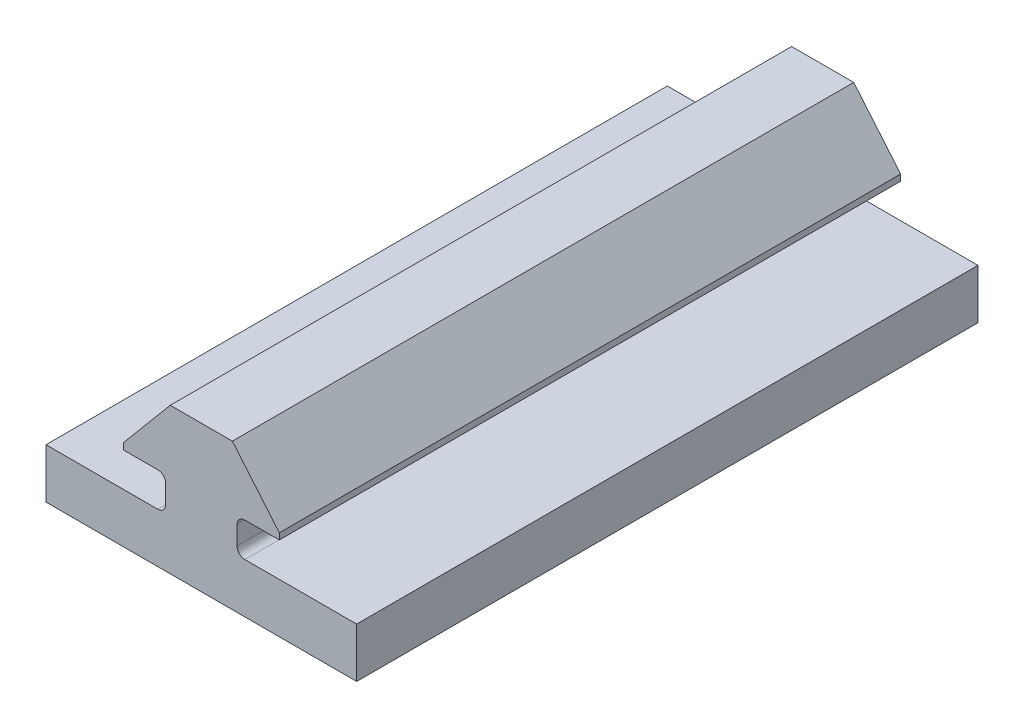
ISO-10303-21;
HEADER;
FILE_DESCRIPTION(('STEP AP214'),'2;1');
FILE_NAME('part.step','',(''),(''),'','','');
FILE_SCHEMA(('AUTOMOTIVE_DESIGN { 1 0 10303 214 1 1 1 1 }'));
ENDSEC;
DATA;
#1=APPLICATION_CONTEXT('core data for automotive mechanical design processes');
#2=APPLICATION_PROTOCOL_DEFINITION('international standard','automotive_design',2000,#1);
#3=PRODUCT_CONTEXT('',#1,'mechanical');
#4=PRODUCT('Part','Part','',(#3));
#5=PRODUCT_RELATED_PRODUCT_CATEGORY('part','',(#4));
#6=PRODUCT_DEFINITION_FORMATION('','',#4);
#7=PRODUCT_DEFINITION_CONTEXT('part definition',#1,'design');
#8=PRODUCT_DEFINITION('design','',#6,#7);
#9=PRODUCT_DEFINITION_SHAPE('','',#8);
#10=(LENGTH_UNIT() NAMED_UNIT(*) SI_UNIT(.MILLI.,.METRE.));
#11=(NAMED_UNIT(*) PLANE_ANGLE_UNIT() SI_UNIT($,.RADIAN.));
#12=(NAMED_UNIT(*) SI_UNIT($,.STERADIAN.) SOLID_ANGLE_UNIT());
#13=UNCERTAINTY_MEASURE_WITH_UNIT(LENGTH_MEASURE(1.E-05),#10,'distance_accuracy_value','');
#14=(GEOMETRIC_REPRESENTATION_CONTEXT(3) GLOBAL_UNCERTAINTY_ASSIGNED_CONTEXT((#13)) GLOBAL_UNIT_ASSIGNED_CONTEXT((#10,
#11,#12)) REPRESENTATION_CONTEXT('',''));
#15=CARTESIAN_POINT('',(0.,0.,0.));
#16=DIRECTION('',(0.,0.,1.));
#17=DIRECTION('',(1.,0.,0.));
#18=AXIS2_PLACEMENT_3D('',#15,#16,#17);
#19=CARTESIAN_POINT('',(-12.7,0.,-3733.8));
#20=DIRECTION('',(1.,0.,0.));
#21=DIRECTION('',(0.,0.,-1.));
#22=AXIS2_PLACEMENT_3D('',#19,#20,#21);
#23=PLANE('',#22);
#24=DIRECTION('',(0.,1.,0.));
#25=VECTOR('',#24,1.);
#26=CARTESIAN_POINT('',(-12.7,0.,-3683.));
#27=LINE('',#26,#25);
#28=CARTESIAN_POINT('',(-12.7,0.,-3683.));
#29=VERTEX_POINT('',#28);
#30=CARTESIAN_POINT('',(-12.7,4.064,-3683.));
#31=VERTEX_POINT('',#30);
#32=EDGE_CURVE('E189',#29,#31,#27,.T.);
#33=ORIENTED_EDGE('',*,*,#32,.T.);
#34=DIRECTION('',(0.,0.,1.));
#35=VECTOR('',#34,1.);
#36=CARTESIAN_POINT('',(-12.7,4.064,-3733.8));
#37=LINE('',#36,#35);
#38=CARTESIAN_POINT('',(-12.7,4.064,-3733.8));
#39=VERTEX_POINT('',#38);
#40=EDGE_CURVE('E11',#39,#31,#37,.T.);
#41=ORIENTED_EDGE('',*,*,#40,.F.);
#42=DIRECTION('',(0.,1.,0.));
#43=VECTOR('',#42,1.);
#44=CARTESIAN_POINT('',(-12.7,0.,-3733.8));
#45=LINE('',#44,#43);
#46=CARTESIAN_POINT('',(-12.7,0.,-3733.8));
#47=VERTEX_POINT('',#46);
#48=EDGE_CURVE('E223',#47,#39,#45,.T.);
#49=ORIENTED_EDGE('',*,*,#48,.F.);
#50=DIRECTION('',(0.,0.,1.));
#51=VECTOR('',#50,1.);
#52=CARTESIAN_POINT('',(-12.7,0.,-3733.8));
#53=LINE('',#52,#51);
#54=EDGE_CURVE('E185',#47,#29,#53,.T.);
#55=ORIENTED_EDGE('',*,*,#54,.T.);
#56=EDGE_LOOP('',(#33,#41,#49,#55));
#57=FACE_BOUND('',#56,.T.);
#58=ADVANCED_FACE('F33',(#57),#23,.F.);
#59=CARTESIAN_POINT('',(-12.7,4.064,-3733.8));
#60=DIRECTION('',(0.,-1.,0.));
#61=DIRECTION('',(0.,0.,-1.));
#62=AXIS2_PLACEMENT_3D('',#59,#60,#61);
#63=PLANE('',#62);
#64=DIRECTION('',(1.,0.,0.));
#65=VECTOR('',#64,1.);
#66=CARTESIAN_POINT('',(-12.7,4.064,-3683.));
#67=LINE('',#66,#65);
#68=CARTESIAN_POINT('',(-3.55599999999985,4.064,-3683.));
#69=VERTEX_POINT('',#68);
#70=EDGE_CURVE('E192',#31,#69,#67,.T.);
#71=ORIENTED_EDGE('',*,*,#70,.T.);
#72=DIRECTION('',(0.,0.,1.));
#73=VECTOR('',#72,1.);
#74=CARTESIAN_POINT('',(-3.55599999999985,4.064,-3733.8));
#75=LINE('',#74,#73);
#76=CARTESIAN_POINT('',(-3.55599999999985,4.064,-3733.8));
#77=VERTEX_POINT('',#76);
#78=EDGE_CURVE('E41',#77,#69,#75,.T.);
#79=ORIENTED_EDGE('',*,*,#78,.F.);
#80=DIRECTION('',(1.,0.,0.));
#81=VECTOR('',#80,1.);
#82=CARTESIAN_POINT('',(-12.7,4.064,-3733.8));
#83=LINE('',#82,#81);
#84=EDGE_CURVE('E122',#39,#77,#83,.T.);
#85=ORIENTED_EDGE('',*,*,#84,.F.);
#86=ORIENTED_EDGE('',*,*,#40,.T.);
#87=EDGE_LOOP('',(#71,#79,#85,#86));
#88=FACE_BOUND('',#87,.T.);
#89=ADVANCED_FACE('F331',(#88),#63,.F.);
#90=CARTESIAN_POINT('',(-3.55599999999985,4.69899999999985,-3733.8));
#91=DIRECTION('',(0.,0.,1.));
#92=DIRECTION('',(1.,0.,0.));
#93=AXIS2_PLACEMENT_3D('',#90,#91,#92);
#94=CYLINDRICAL_SURFACE('',#93,0.634999999999851);
#95=CARTESIAN_POINT('',(-3.55599999999985,4.69899999999985,-3683.));
#96=DIRECTION('',(0.,0.,1.));
#97=DIRECTION('',(1.,0.,0.));
#98=AXIS2_PLACEMENT_3D('',#95,#96,#97);
#99=CIRCLE('',#98,0.634999999999851);
#100=CARTESIAN_POINT('',(-2.921,4.69899999999985,-3683.));
#101=VERTEX_POINT('',#100);
#102=EDGE_CURVE('E194',#69,#101,#99,.T.);
#103=ORIENTED_EDGE('',*,*,#102,.T.);
#104=DIRECTION('',(0.,0.,1.));
#105=VECTOR('',#104,1.);
#106=CARTESIAN_POINT('',(-2.921,4.69899999999985,-3733.8));
#107=LINE('',#106,#105);
#108=CARTESIAN_POINT('',(-2.921,4.69899999999985,-3733.8));
#109=VERTEX_POINT('',#108);
#110=EDGE_CURVE('E260',#109,#101,#107,.T.);
#111=ORIENTED_EDGE('',*,*,#110,.F.);
#112=CARTESIAN_POINT('',(-3.55599999999985,4.69899999999985,-3733.8));
#113=DIRECTION('',(0.,0.,1.));
#114=DIRECTION('',(1.,0.,0.));
#115=AXIS2_PLACEMENT_3D('',#112,#113,#114);
#116=CIRCLE('',#115,0.634999999999851);
#117=EDGE_CURVE('E268',#77,#109,#116,.T.);
#118=ORIENTED_EDGE('',*,*,#117,.F.);
#119=ORIENTED_EDGE('',*,*,#78,.T.);
#120=EDGE_LOOP('',(#103,#111,#118,#119));
#121=FACE_BOUND('',#120,.T.);
#122=ADVANCED_FACE('F266',(#121),#94,.F.);
#123=CARTESIAN_POINT('',(-2.92099999999999,4.69899999999985,-3733.8));
#124=DIRECTION('',(1.,0.,0.));
#125=DIRECTION('',(0.,1.,0.));
#126=AXIS2_PLACEMENT_3D('',#123,#124,#125);
#127=PLANE('',#126);
#128=DIRECTION('',(0.,1.,0.));
#129=VECTOR('',#128,1.);
#130=CARTESIAN_POINT('',(-2.92099999999999,4.69899999999985,-3683.));
#131=LINE('',#130,#129);
#132=CARTESIAN_POINT('',(-2.921,6.22300000000015,-3683.));
#133=VERTEX_POINT('',#132);
#134=EDGE_CURVE('E196',#101,#133,#131,.T.);
#135=ORIENTED_EDGE('',*,*,#134,.T.);
#136=DIRECTION('',(0.,0.,1.));
#137=VECTOR('',#136,1.);
#138=CARTESIAN_POINT('',(-2.921,6.22300000000015,-3733.8));
#139=LINE('',#138,#137);
#140=CARTESIAN_POINT('',(-2.921,6.22300000000015,-3733.8));
#141=VERTEX_POINT('',#140);
#142=EDGE_CURVE('E257',#141,#133,#139,.T.);
#143=ORIENTED_EDGE('',*,*,#142,.F.);
#144=DIRECTION('',(0.,1.,0.));
#145=VECTOR('',#144,1.);
#146=CARTESIAN_POINT('',(-2.92099999999999,4.69899999999985,-3733.8));
#147=LINE('',#146,#145);
#148=EDGE_CURVE('E286',#109,#141,#147,.T.);
#149=ORIENTED_EDGE('',*,*,#148,.F.);
#150=ORIENTED_EDGE('',*,*,#110,.T.);
#151=EDGE_LOOP('',(#135,#143,#149,#150));
#152=FACE_BOUND('',#151,.T.);
#153=ADVANCED_FACE('F277',(#152),#127,.F.);
#154=CARTESIAN_POINT('',(-3.55599999999985,6.22300000000015,-3733.8));
#155=DIRECTION('',(0.,0.,1.));
#156=DIRECTION('',(1.,0.,0.));
#157=AXIS2_PLACEMENT_3D('',#154,#155,#156);
#158=CYLINDRICAL_SURFACE('',#157,0.634999999999851);
#159=CARTESIAN_POINT('',(-3.55599999999985,6.22300000000015,-3683.));
#160=DIRECTION('',(0.,0.,1.));
#161=DIRECTION('',(1.,0.,0.));
#162=AXIS2_PLACEMENT_3D('',#159,#160,#161);
#163=CIRCLE('',#162,0.634999999999851);
#164=CARTESIAN_POINT('',(-3.55599999999985,6.858,-3683.));
#165=VERTEX_POINT('',#164);
#166=EDGE_CURVE('E198',#133,#165,#163,.T.);
#167=ORIENTED_EDGE('',*,*,#166,.T.);
#168=DIRECTION('',(0.,0.,1.));
#169=VECTOR('',#168,1.);
#170=CARTESIAN_POINT('',(-3.55599999999985,6.858,-3733.8));
#171=LINE('',#170,#169);
#172=CARTESIAN_POINT('',(-3.55599999999985,6.858,-3733.8));
#173=VERTEX_POINT('',#172);
#174=EDGE_CURVE('E254',#173,#165,#171,.T.);
#175=ORIENTED_EDGE('',*,*,#174,.F.);
#176=CARTESIAN_POINT('',(-3.55599999999985,6.22300000000015,-3733.8));
#177=DIRECTION('',(0.,0.,1.));
#178=DIRECTION('',(1.,0.,0.));
#179=AXIS2_PLACEMENT_3D('',#176,#177,#178);
#180=CIRCLE('',#179,0.634999999999851);
#181=EDGE_CURVE('E283',#141,#173,#180,.T.);
#182=ORIENTED_EDGE('',*,*,#181,.F.);
#183=ORIENTED_EDGE('',*,*,#142,.T.);
#184=EDGE_LOOP('',(#167,#175,#182,#183));
#185=FACE_BOUND('',#184,.T.);
#186=ADVANCED_FACE('F281',(#185),#158,.F.);
#187=CARTESIAN_POINT('',(-3.55599999999985,6.85800000000001,-3733.8));
#188=DIRECTION('',(0.,1.,0.));
#189=DIRECTION('',(-1.,0.,0.));
#190=AXIS2_PLACEMENT_3D('',#187,#188,#189);
#191=PLANE('',#190);
#192=DIRECTION('',(-1.,0.,0.));
#193=VECTOR('',#192,1.);
#194=CARTESIAN_POINT('',(-3.55599999999985,6.85800000000001,-3683.));
#195=LINE('',#194,#193);
#196=CARTESIAN_POINT('',(-6.376363549,6.858,-3683.));
#197=VERTEX_POINT('',#196);
#198=EDGE_CURVE('E200',#165,#197,#195,.T.);
#199=ORIENTED_EDGE('',*,*,#198,.T.);
#200=DIRECTION('',(0.,0.,1.));
#201=VECTOR('',#200,1.);
#202=CARTESIAN_POINT('',(-6.376363549,6.858,-3733.8));
#203=LINE('',#202,#201);
#204=CARTESIAN_POINT('',(-6.376363549,6.858,-3733.8));
#205=VERTEX_POINT('',#204);
#206=EDGE_CURVE('E251',#205,#197,#203,.T.);
#207=ORIENTED_EDGE('',*,*,#206,.F.);
#208=DIRECTION('',(-1.,0.,0.));
#209=VECTOR('',#208,1.);
#210=CARTESIAN_POINT('',(-3.55599999999985,6.85800000000001,-3733.8));
#211=LINE('',#210,#209);
#212=EDGE_CURVE('E285',#173,#205,#211,.T.);
#213=ORIENTED_EDGE('',*,*,#212,.F.);
#214=ORIENTED_EDGE('',*,*,#174,.T.);
#215=EDGE_LOOP('',(#199,#207,#213,#214));
#216=FACE_BOUND('',#215,.T.);
#217=ADVANCED_FACE('F344',(#216),#191,.F.);
#218=CARTESIAN_POINT('',(-6.376363549,6.858,-3733.8));
#219=DIRECTION('',(1.,0.,0.));
#220=DIRECTION('',(0.,0.,-1.));
#221=AXIS2_PLACEMENT_3D('',#218,#219,#220);
#222=PLANE('',#221);
#223=DIRECTION('',(0.,1.,0.));
#224=VECTOR('',#223,1.);
#225=CARTESIAN_POINT('',(-6.376363549,6.858,-3683.));
#226=LINE('',#225,#224);
#227=CARTESIAN_POINT('',(-6.376363549,7.36599995798179,-3683.));
#228=VERTEX_POINT('',#227);
#229=EDGE_CURVE('E202',#197,#228,#226,.T.);
#230=ORIENTED_EDGE('',*,*,#229,.T.);
#231=DIRECTION('',(0.,0.,1.));
#232=VECTOR('',#231,1.);
#233=CARTESIAN_POINT('',(-6.376363549,7.36599995798179,-3733.8));
#234=LINE('',#233,#232);
#235=CARTESIAN_POINT('',(-6.376363549,7.36599995798179,-3733.8));
#236=VERTEX_POINT('',#235);
#237=EDGE_CURVE('E248',#236,#228,#234,.T.);
#238=ORIENTED_EDGE('',*,*,#237,.F.);
#239=DIRECTION('',(0.,1.,0.));
#240=VECTOR('',#239,1.);
#241=CARTESIAN_POINT('',(-6.376363549,6.858,-3733.8));
#242=LINE('',#241,#240);
#243=EDGE_CURVE('E288',#205,#236,#242,.T.);
#244=ORIENTED_EDGE('',*,*,#243,.F.);
#245=ORIENTED_EDGE('',*,*,#206,.T.);
#246=EDGE_LOOP('',(#230,#238,#244,#245));
#247=FACE_BOUND('',#246,.T.);
#248=ADVANCED_FACE('F347',(#247),#222,.F.);
#249=CARTESIAN_POINT('',(-6.376363549,7.36599995798179,-3733.8));
#250=DIRECTION('',(0.766044443118977,-0.642787609686541,0.));
#251=DIRECTION('',(0.642787609686541,0.766044443118977,0.));
#252=AXIS2_PLACEMENT_3D('',#249,#250,#251);
#253=PLANE('',#252);
#254=DIRECTION('',(0.642787609686541,0.766044443118977,0.));
#255=VECTOR('',#254,1.);
#256=CARTESIAN_POINT('',(-6.376363549,7.36599995798179,-3683.));
#257=LINE('',#256,#255);
#258=CARTESIAN_POINT('',(-2.54,11.938,-3683.));
#259=VERTEX_POINT('',#258);
#260=EDGE_CURVE('E204',#228,#259,#257,.T.);
#261=ORIENTED_EDGE('',*,*,#260,.T.);
#262=DIRECTION('',(0.,0.,1.));
#263=VECTOR('',#262,1.);
#264=CARTESIAN_POINT('',(-2.54,11.938,-3733.8));
#265=LINE('',#264,#263);
#266=CARTESIAN_POINT('',(-2.54,11.938,-3733.8));
#267=VERTEX_POINT('',#266);
#268=EDGE_CURVE('E245',#267,#259,#265,.T.);
#269=ORIENTED_EDGE('',*,*,#268,.F.);
#270=DIRECTION('',(0.642787609686541,0.766044443118977,0.));
#271=VECTOR('',#270,1.);
#272=CARTESIAN_POINT('',(-6.376363549,7.36599995798179,-3733.8));
#273=LINE('',#272,#271);
#274=EDGE_CURVE('E294',#236,#267,#273,.T.);
#275=ORIENTED_EDGE('',*,*,#274,.F.);
#276=ORIENTED_EDGE('',*,*,#237,.T.);
#277=EDGE_LOOP('',(#261,#269,#275,#276));
#278=FACE_BOUND('',#277,.T.);
#279=ADVANCED_FACE('F351',(#278),#253,.F.);
#280=CARTESIAN_POINT('',(-2.54,11.938,-3733.8));
#281=DIRECTION('',(0.,-1.,0.));
#282=DIRECTION('',(0.,0.,-1.));
#283=AXIS2_PLACEMENT_3D('',#280,#281,#282);
#284=PLANE('',#283);
#285=DIRECTION('',(1.,0.,0.));
#286=VECTOR('',#285,1.);
#287=CARTESIAN_POINT('',(-2.54,11.938,-3683.));
#288=LINE('',#287,#286);
#289=CARTESIAN_POINT('',(2.54,11.938,-3683.));
#290=VERTEX_POINT('',#289);
#291=EDGE_CURVE('E206',#259,#290,#288,.T.);
#292=ORIENTED_EDGE('',*,*,#291,.T.);
#293=DIRECTION('',(0.,0.,1.));
#294=VECTOR('',#293,1.);
#295=CARTESIAN_POINT('',(2.54,11.938,-3733.8));
#296=LINE('',#295,#294);
#297=CARTESIAN_POINT('',(2.54,11.938,-3733.8));
#298=VERTEX_POINT('',#297);
#299=EDGE_CURVE('E242',#298,#290,#296,.T.);
#300=ORIENTED_EDGE('',*,*,#299,.F.);
#301=DIRECTION('',(1.,0.,0.));
#302=VECTOR('',#301,1.);
#303=CARTESIAN_POINT('',(-2.54,11.938,-3733.8));
#304=LINE('',#303,#302);
#305=EDGE_CURVE('E296',#267,#298,#304,.T.);
#306=ORIENTED_EDGE('',*,*,#305,.F.);
#307=ORIENTED_EDGE('',*,*,#268,.T.);
#308=EDGE_LOOP('',(#292,#300,#306,#307));
#309=FACE_BOUND('',#308,.T.);
#310=ADVANCED_FACE('F355',(#309),#284,.F.);
#311=CARTESIAN_POINT('',(2.54,11.938,-3733.8));
#312=DIRECTION('',(-0.766044443118977,-0.642787609686541,0.));
#313=DIRECTION('',(0.642787609686541,-0.766044443118977,0.));
#314=AXIS2_PLACEMENT_3D('',#311,#312,#313);
#315=PLANE('',#314);
#316=DIRECTION('',(0.642787609686541,-0.766044443118977,0.));
#317=VECTOR('',#316,1.);
#318=CARTESIAN_POINT('',(2.54,11.938,-3683.));
#319=LINE('',#318,#317);
#320=CARTESIAN_POINT('',(6.376363549,7.36599995798179,-3683.));
#321=VERTEX_POINT('',#320);
#322=EDGE_CURVE('E208',#290,#321,#319,.T.);
#323=ORIENTED_EDGE('',*,*,#322,.T.);
#324=DIRECTION('',(0.,0.,1.));
#325=VECTOR('',#324,1.);
#326=CARTESIAN_POINT('',(6.376363549,7.36599995798179,-3733.8));
#327=LINE('',#326,#325);
#328=CARTESIAN_POINT('',(6.376363549,7.36599995798179,-3733.8));
#329=VERTEX_POINT('',#328);
#330=EDGE_CURVE('E239',#329,#321,#327,.T.);
#331=ORIENTED_EDGE('',*,*,#330,.F.);
#332=DIRECTION('',(0.642787609686541,-0.766044443118977,0.));
#333=VECTOR('',#332,1.);
#334=CARTESIAN_POINT('',(2.54,11.938,-3733.8));
#335=LINE('',#334,#333);
#336=EDGE_CURVE('E298',#298,#329,#335,.T.);
#337=ORIENTED_EDGE('',*,*,#336,.F.);
#338=ORIENTED_EDGE('',*,*,#299,.T.);
#339=EDGE_LOOP('',(#323,#331,#337,#338));
#340=FACE_BOUND('',#339,.T.);
#341=ADVANCED_FACE('F359',(#340),#315,.F.);
#342=CARTESIAN_POINT('',(6.376363549,7.36599995798179,-3733.8));
#343=DIRECTION('',(-1.,0.,0.));
#344=DIRECTION('',(0.,0.,1.));
#345=AXIS2_PLACEMENT_3D('',#342,#343,#344);
#346=PLANE('',#345);
#347=DIRECTION('',(0.,-1.,0.));
#348=VECTOR('',#347,1.);
#349=CARTESIAN_POINT('',(6.376363549,7.36599995798179,-3683.));
#350=LINE('',#349,#348);
#351=CARTESIAN_POINT('',(6.376363549,6.858,-3683.));
#352=VERTEX_POINT('',#351);
#353=EDGE_CURVE('E210',#321,#352,#350,.T.);
#354=ORIENTED_EDGE('',*,*,#353,.T.);
#355=DIRECTION('',(0.,0.,1.));
#356=VECTOR('',#355,1.);
#357=CARTESIAN_POINT('',(6.376363549,6.858,-3733.8));
#358=LINE('',#357,#356);
#359=CARTESIAN_POINT('',(6.376363549,6.858,-3733.8));
#360=VERTEX_POINT('',#359);
#361=EDGE_CURVE('E236',#360,#352,#358,.T.);
#362=ORIENTED_EDGE('',*,*,#361,.F.);
#363=DIRECTION('',(0.,-1.,0.));
#364=VECTOR('',#363,1.);
#365=CARTESIAN_POINT('',(6.376363549,7.36599995798179,-3733.8));
#366=LINE('',#365,#364);
#367=EDGE_CURVE('E300',#329,#360,#366,.T.);
#368=ORIENTED_EDGE('',*,*,#367,.F.);
#369=ORIENTED_EDGE('',*,*,#330,.T.);
#370=EDGE_LOOP('',(#354,#362,#368,#369));
#371=FACE_BOUND('',#370,.T.);
#372=ADVANCED_FACE('F363',(#371),#346,.F.);
#373=CARTESIAN_POINT('',(6.376363549,6.858,-3733.8));
#374=DIRECTION('',(0.,1.,0.));
#375=DIRECTION('',(0.,0.,1.));
#376=AXIS2_PLACEMENT_3D('',#373,#374,#375);
#377=PLANE('',#376);
#378=DIRECTION('',(-1.,0.,0.));
#379=VECTOR('',#378,1.);
#380=CARTESIAN_POINT('',(6.376363549,6.858,-3683.));
#381=LINE('',#380,#379);
#382=CARTESIAN_POINT('',(3.55599999999985,6.858,-3683.));
#383=VERTEX_POINT('',#382);
#384=EDGE_CURVE('E212',#352,#383,#381,.T.);
#385=ORIENTED_EDGE('',*,*,#384,.T.);
#386=DIRECTION('',(0.,0.,1.));
#387=VECTOR('',#386,1.);
#388=CARTESIAN_POINT('',(3.55599999999985,6.858,-3733.8));
#389=LINE('',#388,#387);
#390=CARTESIAN_POINT('',(3.55599999999985,6.858,-3733.8));
#391=VERTEX_POINT('',#390);
#392=EDGE_CURVE('E233',#391,#383,#389,.T.);
#393=ORIENTED_EDGE('',*,*,#392,.F.);
#394=DIRECTION('',(-1.,0.,0.));
#395=VECTOR('',#394,1.);
#396=CARTESIAN_POINT('',(6.376363549,6.858,-3733.8));
#397=LINE('',#396,#395);
#398=EDGE_CURVE('E302',#360,#391,#397,.T.);
#399=ORIENTED_EDGE('',*,*,#398,.F.);
#400=ORIENTED_EDGE('',*,*,#361,.T.);
#401=EDGE_LOOP('',(#385,#393,#399,#400));
#402=FACE_BOUND('',#401,.T.);
#403=ADVANCED_FACE('F367',(#402),#377,.F.);
#404=CARTESIAN_POINT('',(3.55599999999985,6.22300000000015,-3733.8));
#405=DIRECTION('',(0.,0.,1.));
#406=DIRECTION('',(1.,0.,0.));
#407=AXIS2_PLACEMENT_3D('',#404,#405,#406);
#408=CYLINDRICAL_SURFACE('',#407,0.634999999999851);
#409=CARTESIAN_POINT('',(3.55599999999985,6.22300000000015,-3683.));
#410=DIRECTION('',(0.,0.,1.));
#411=DIRECTION('',(1.,0.,0.));
#412=AXIS2_PLACEMENT_3D('',#409,#410,#411);
#413=CIRCLE('',#412,0.634999999999851);
#414=CARTESIAN_POINT('',(2.921,6.22300000000015,-3683.));
#415=VERTEX_POINT('',#414);
#416=EDGE_CURVE('E214',#383,#415,#413,.T.);
#417=ORIENTED_EDGE('',*,*,#416,.T.);
#418=DIRECTION('',(0.,0.,1.));
#419=VECTOR('',#418,1.);
#420=CARTESIAN_POINT('',(2.921,6.22300000000015,-3733.8));
#421=LINE('',#420,#419);
#422=CARTESIAN_POINT('',(2.921,6.22300000000015,-3733.8));
#423=VERTEX_POINT('',#422);
#424=EDGE_CURVE('E230',#423,#415,#421,.T.);
#425=ORIENTED_EDGE('',*,*,#424,.F.);
#426=CARTESIAN_POINT('',(3.55599999999985,6.22300000000015,-3733.8));
#427=DIRECTION('',(0.,0.,1.));
#428=DIRECTION('',(1.,0.,0.));
#429=AXIS2_PLACEMENT_3D('',#426,#427,#428);
#430=CIRCLE('',#429,0.634999999999851);
#431=EDGE_CURVE('E304',#391,#423,#430,.T.);
#432=ORIENTED_EDGE('',*,*,#431,.F.);
#433=ORIENTED_EDGE('',*,*,#392,.T.);
#434=EDGE_LOOP('',(#417,#425,#432,#433));
#435=FACE_BOUND('',#434,.T.);
#436=ADVANCED_FACE('F371',(#435),#408,.F.);
#437=CARTESIAN_POINT('',(2.92099999999999,6.22300000000015,-3733.8));
#438=DIRECTION('',(-1.,0.,0.));
#439=DIRECTION('',(0.,-1.,0.));
#440=AXIS2_PLACEMENT_3D('',#437,#438,#439);
#441=PLANE('',#440);
#442=DIRECTION('',(0.,-1.,0.));
#443=VECTOR('',#442,1.);
#444=CARTESIAN_POINT('',(2.92099999999999,6.22300000000015,-3683.));
#445=LINE('',#444,#443);
#446=CARTESIAN_POINT('',(2.921,4.69899999999985,-3683.));
#447=VERTEX_POINT('',#446);
#448=EDGE_CURVE('E216',#415,#447,#445,.T.);
#449=ORIENTED_EDGE('',*,*,#448,.T.);
#450=DIRECTION('',(0.,0.,1.));
#451=VECTOR('',#450,1.);
#452=CARTESIAN_POINT('',(2.921,4.69899999999985,-3733.8));
#453=LINE('',#452,#451);
#454=CARTESIAN_POINT('',(2.921,4.69899999999985,-3733.8));
#455=VERTEX_POINT('',#454);
#456=EDGE_CURVE('E227',#455,#447,#453,.T.);
#457=ORIENTED_EDGE('',*,*,#456,.F.);
#458=DIRECTION('',(0.,-1.,0.));
#459=VECTOR('',#458,1.);
#460=CARTESIAN_POINT('',(2.92099999999999,6.22300000000015,-3733.8));
#461=LINE('',#460,#459);
#462=EDGE_CURVE('E306',#423,#455,#461,.T.);
#463=ORIENTED_EDGE('',*,*,#462,.F.);
#464=ORIENTED_EDGE('',*,*,#424,.T.);
#465=EDGE_LOOP('',(#449,#457,#463,#464));
#466=FACE_BOUND('',#465,.T.);
#467=ADVANCED_FACE('F312',(#466),#441,.F.);
#468=CARTESIAN_POINT('',(3.55599999999985,4.69899999999985,-3733.8));
#469=DIRECTION('',(0.,0.,1.));
#470=DIRECTION('',(1.,0.,0.));
#471=AXIS2_PLACEMENT_3D('',#468,#469,#470);
#472=CYLINDRICAL_SURFACE('',#471,0.634999999999851);
#473=CARTESIAN_POINT('',(3.55599999999985,4.69899999999985,-3683.));
#474=DIRECTION('',(0.,0.,1.));
#475=DIRECTION('',(1.,0.,0.));
#476=AXIS2_PLACEMENT_3D('',#473,#474,#475);
#477=CIRCLE('',#476,0.634999999999851);
#478=CARTESIAN_POINT('',(3.55599999999985,4.064,-3683.));
#479=VERTEX_POINT('',#478);
#480=EDGE_CURVE('E218',#447,#479,#477,.T.);
#481=ORIENTED_EDGE('',*,*,#480,.T.);
#482=DIRECTION('',(0.,0.,1.));
#483=VECTOR('',#482,1.);
#484=CARTESIAN_POINT('',(3.55599999999985,4.064,-3733.8));
#485=LINE('',#484,#483);
#486=CARTESIAN_POINT('',(3.55599999999985,4.064,-3733.8));
#487=VERTEX_POINT('',#486);
#488=EDGE_CURVE('E180',#487,#479,#485,.T.);
#489=ORIENTED_EDGE('',*,*,#488,.F.);
#490=CARTESIAN_POINT('',(3.55599999999985,4.69899999999985,-3733.8));
#491=DIRECTION('',(0.,0.,1.));
#492=DIRECTION('',(1.,0.,0.));
#493=AXIS2_PLACEMENT_3D('',#490,#491,#492);
#494=CIRCLE('',#493,0.634999999999851);
#495=EDGE_CURVE('E171',#455,#487,#494,.T.);
#496=ORIENTED_EDGE('',*,*,#495,.F.);
#497=ORIENTED_EDGE('',*,*,#456,.T.);
#498=EDGE_LOOP('',(#481,#489,#496,#497));
#499=FACE_BOUND('',#498,.T.);
#500=ADVANCED_FACE('F316',(#499),#472,.F.);
#501=CARTESIAN_POINT('',(3.55599999999985,4.06399999999999,-3733.8));
#502=DIRECTION('',(0.,-1.,0.));
#503=DIRECTION('',(1.,0.,0.));
#504=AXIS2_PLACEMENT_3D('',#501,#502,#503);
#505=PLANE('',#504);
#506=DIRECTION('',(1.,0.,0.));
#507=VECTOR('',#506,1.);
#508=CARTESIAN_POINT('',(3.55599999999985,4.06399999999999,-3683.));
#509=LINE('',#508,#507);
#510=CARTESIAN_POINT('',(12.7,4.064,-3683.));
#511=VERTEX_POINT('',#510);
#512=EDGE_CURVE('E179',#479,#511,#509,.T.);
#513=ORIENTED_EDGE('',*,*,#512,.T.);
#514=DIRECTION('',(0.,0.,1.));
#515=VECTOR('',#514,1.);
#516=CARTESIAN_POINT('',(12.7,4.064,-3733.8));
#517=LINE('',#516,#515);
#518=CARTESIAN_POINT('',(12.7,4.064,-3733.8));
#519=VERTEX_POINT('',#518);
#520=EDGE_CURVE('E176',#519,#511,#517,.T.);
#521=ORIENTED_EDGE('',*,*,#520,.F.);
#522=DIRECTION('',(1.,0.,0.));
#523=VECTOR('',#522,1.);
#524=CARTESIAN_POINT('',(3.55599999999985,4.06399999999999,-3733.8));
#525=LINE('',#524,#523);
#526=EDGE_CURVE('E165',#487,#519,#525,.T.);
#527=ORIENTED_EDGE('',*,*,#526,.F.);
#528=ORIENTED_EDGE('',*,*,#488,.T.);
#529=EDGE_LOOP('',(#513,#521,#527,#528));
#530=FACE_BOUND('',#529,.T.);
#531=ADVANCED_FACE('F177',(#530),#505,.F.);
#532=CARTESIAN_POINT('',(12.7,4.064,-3733.8));
#533=DIRECTION('',(-1.,0.,0.));
#534=DIRECTION('',(0.,0.,1.));
#535=AXIS2_PLACEMENT_3D('',#532,#533,#534);
#536=PLANE('',#535);
#537=DIRECTION('',(0.,-1.,0.));
#538=VECTOR('',#537,1.);
#539=CARTESIAN_POINT('',(12.7,4.064,-3683.));
#540=LINE('',#539,#538);
#541=CARTESIAN_POINT('',(12.7,0.,-3683.));
#542=VERTEX_POINT('',#541);
#543=EDGE_CURVE('E108',#511,#542,#540,.T.);
#544=ORIENTED_EDGE('',*,*,#543,.T.);
#545=DIRECTION('',(0.,0.,1.));
#546=VECTOR('',#545,1.);
#547=CARTESIAN_POINT('',(12.7,0.,-3733.8));
#548=LINE('',#547,#546);
#549=CARTESIAN_POINT('',(12.7,0.,-3733.8));
#550=VERTEX_POINT('',#549);
#551=EDGE_CURVE('E181',#550,#542,#548,.T.);
#552=ORIENTED_EDGE('',*,*,#551,.F.);
#553=DIRECTION('',(0.,-1.,0.));
#554=VECTOR('',#553,1.);
#555=CARTESIAN_POINT('',(12.7,4.064,-3733.8));
#556=LINE('',#555,#554);
#557=EDGE_CURVE('E169',#519,#550,#556,.T.);
#558=ORIENTED_EDGE('',*,*,#557,.F.);
#559=ORIENTED_EDGE('',*,*,#520,.T.);
#560=EDGE_LOOP('',(#544,#552,#558,#559));
#561=FACE_BOUND('',#560,.T.);
#562=ADVANCED_FACE('F183',(#561),#536,.F.);
#563=CARTESIAN_POINT('',(12.7,0.,-3733.8));
#564=DIRECTION('',(0.,1.,0.));
#565=DIRECTION('',(0.,0.,1.));
#566=AXIS2_PLACEMENT_3D('',#563,#564,#565);
#567=PLANE('',#566);
#568=DIRECTION('',(-1.,0.,0.));
#569=VECTOR('',#568,1.);
#570=CARTESIAN_POINT('',(12.7,0.,-3683.));
#571=LINE('',#570,#569);
#572=EDGE_CURVE('E114',#542,#29,#571,.T.);
#573=ORIENTED_EDGE('',*,*,#572,.T.);
#574=ORIENTED_EDGE('',*,*,#54,.F.);
#575=DIRECTION('',(-1.,0.,0.));
#576=VECTOR('',#575,1.);
#577=CARTESIAN_POINT('',(12.7,0.,-3733.8));
#578=LINE('',#577,#576);
#579=EDGE_CURVE('E49',#550,#47,#578,.T.);
#580=ORIENTED_EDGE('',*,*,#579,.F.);
#581=ORIENTED_EDGE('',*,*,#551,.T.);
#582=EDGE_LOOP('',(#573,#574,#580,#581));
#583=FACE_BOUND('',#582,.T.);
#584=ADVANCED_FACE('F320',(#583),#567,.F.);
#585=CARTESIAN_POINT('',(-3.55599999999985,4.69899999999985,-3733.8));
#586=DIRECTION('',(0.,0.,1.));
#587=DIRECTION('',(1.,0.,0.));
#588=AXIS2_PLACEMENT_3D('',#585,#586,#587);
#589=PLANE('',#588);
#590=ORIENTED_EDGE('',*,*,#48,.T.);
#591=ORIENTED_EDGE('',*,*,#84,.T.);
#592=ORIENTED_EDGE('',*,*,#117,.T.);
#593=ORIENTED_EDGE('',*,*,#148,.T.);
#594=ORIENTED_EDGE('',*,*,#181,.T.);
#595=ORIENTED_EDGE('',*,*,#212,.T.);
#596=ORIENTED_EDGE('',*,*,#243,.T.);
#597=ORIENTED_EDGE('',*,*,#274,.T.);
#598=ORIENTED_EDGE('',*,*,#305,.T.);
#599=ORIENTED_EDGE('',*,*,#336,.T.);
#600=ORIENTED_EDGE('',*,*,#367,.T.);
#601=ORIENTED_EDGE('',*,*,#398,.T.);
#602=ORIENTED_EDGE('',*,*,#431,.T.);
#603=ORIENTED_EDGE('',*,*,#462,.T.);
#604=ORIENTED_EDGE('',*,*,#495,.T.);
#605=ORIENTED_EDGE('',*,*,#526,.T.);
#606=ORIENTED_EDGE('',*,*,#557,.T.);
#607=ORIENTED_EDGE('',*,*,#579,.T.);
#608=EDGE_LOOP('',(#590,#591,#592,#593,#594,#595,#596,#597,#598,#599,#600,#601,#602,#603,#604,
#605,#606,#607));
#609=FACE_BOUND('',#608,.T.);
#610=ADVANCED_FACE('F167',(#609),#589,.F.);
#611=CARTESIAN_POINT('',(-3.55599999999985,4.69899999999985,-3683.));
#612=DIRECTION('',(0.,0.,1.));
#613=DIRECTION('',(1.,0.,0.));
#614=AXIS2_PLACEMENT_3D('',#611,#612,#613);
#615=PLANE('',#614);
#616=ORIENTED_EDGE('',*,*,#32,.F.);
#617=ORIENTED_EDGE('',*,*,#572,.F.);
#618=ORIENTED_EDGE('',*,*,#543,.F.);
#619=ORIENTED_EDGE('',*,*,#512,.F.);
#620=ORIENTED_EDGE('',*,*,#480,.F.);
#621=ORIENTED_EDGE('',*,*,#448,.F.);
#622=ORIENTED_EDGE('',*,*,#416,.F.);
#623=ORIENTED_EDGE('',*,*,#384,.F.);
#624=ORIENTED_EDGE('',*,*,#353,.F.);
#625=ORIENTED_EDGE('',*,*,#322,.F.);
#626=ORIENTED_EDGE('',*,*,#291,.F.);
#627=ORIENTED_EDGE('',*,*,#260,.F.);
#628=ORIENTED_EDGE('',*,*,#229,.F.);
#629=ORIENTED_EDGE('',*,*,#198,.F.);
#630=ORIENTED_EDGE('',*,*,#166,.F.);
#631=ORIENTED_EDGE('',*,*,#134,.F.);
#632=ORIENTED_EDGE('',*,*,#102,.F.);
#633=ORIENTED_EDGE('',*,*,#70,.F.);
#634=EDGE_LOOP('',(#616,#617,#618,#619,#620,#621,#622,#623,#624,#625,#626,#627,#628,#629,#630,
#631,#632,#633));
#635=FACE_BOUND('',#634,.T.);
#636=ADVANCED_FACE('F272',(#635),#615,.T.);
#637=CLOSED_SHELL('',(#58,#89,#122,#153,#186,#217,#248,#279,#310,#341,#372,#403,#436,#467,#500,
#531,#562,#584,#610,#636));
#638=MANIFOLD_SOLID_BREP('B2',#637);
#639=ADVANCED_BREP_SHAPE_REPRESENTATION('',(#18,#638),#14);
#640=SHAPE_DEFINITION_REPRESENTATION(#9,#639);
ENDSEC;
END-ISO-10303-21;
